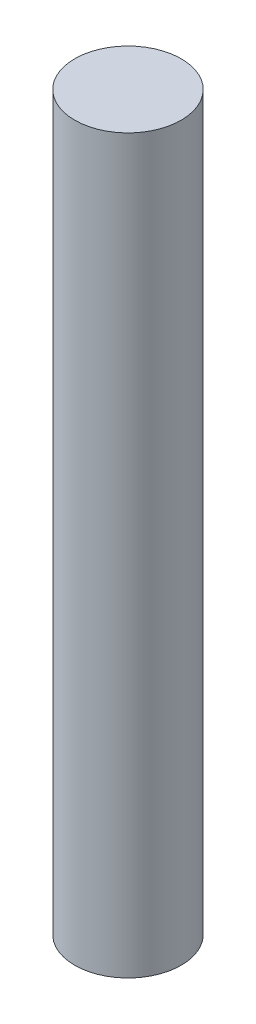
ISO-10303-21;
HEADER;
FILE_DESCRIPTION(('STEP AP214'),'2;1');
FILE_NAME('part.step','',(''),(''),'','','');
FILE_SCHEMA(('AUTOMOTIVE_DESIGN { 1 0 10303 214 1 1 1 1 }'));
ENDSEC;
DATA;
#1=APPLICATION_CONTEXT('core data for automotive mechanical design processes');
#2=APPLICATION_PROTOCOL_DEFINITION('international standard','automotive_design',2000,#1);
#3=PRODUCT_CONTEXT('',#1,'mechanical');
#4=PRODUCT('Part','Part','',(#3));
#5=PRODUCT_RELATED_PRODUCT_CATEGORY('part','',(#4));
#6=PRODUCT_DEFINITION_FORMATION('','',#4);
#7=PRODUCT_DEFINITION_CONTEXT('part definition',#1,'design');
#8=PRODUCT_DEFINITION('design','',#6,#7);
#9=PRODUCT_DEFINITION_SHAPE('','',#8);
#10=(LENGTH_UNIT() NAMED_UNIT(*) SI_UNIT(.MILLI.,.METRE.));
#11=(NAMED_UNIT(*) PLANE_ANGLE_UNIT() SI_UNIT($,.RADIAN.));
#12=(NAMED_UNIT(*) SI_UNIT($,.STERADIAN.) SOLID_ANGLE_UNIT());
#13=UNCERTAINTY_MEASURE_WITH_UNIT(LENGTH_MEASURE(1.E-05),#10,'distance_accuracy_value','');
#14=(GEOMETRIC_REPRESENTATION_CONTEXT(3) GLOBAL_UNCERTAINTY_ASSIGNED_CONTEXT((#13)) GLOBAL_UNIT_ASSIGNED_CONTEXT((#10,
#11,#12)) REPRESENTATION_CONTEXT('',''));
#15=CARTESIAN_POINT('',(0.,0.,0.));
#16=DIRECTION('',(0.,0.,1.));
#17=DIRECTION('',(1.,0.,0.));
#18=AXIS2_PLACEMENT_3D('',#15,#16,#17);
#19=CARTESIAN_POINT('',(0.,55.,0.));
#20=DIRECTION('',(0.,-1.,0.));
#21=DIRECTION('',(0.,0.,-1.));
#22=AXIS2_PLACEMENT_3D('',#19,#20,#21);
#23=CYLINDRICAL_SURFACE('',#22,4.);
#24=CARTESIAN_POINT('',(0.,55.,0.));
#25=DIRECTION('',(0.,1.,0.));
#26=DIRECTION('',(0.,0.,1.));
#27=AXIS2_PLACEMENT_3D('',#24,#25,#26);
#28=CIRCLE('',#27,4.);
#29=CARTESIAN_POINT('',(0.,55.,4.));
#30=VERTEX_POINT('',#29);
#31=EDGE_CURVE('E10',#30,#30,#28,.T.);
#32=ORIENTED_EDGE('',*,*,#31,.F.);
#33=EDGE_LOOP('',(#32));
#34=FACE_BOUND('',#33,.T.);
#35=CARTESIAN_POINT('',(0.,0.,0.));
#36=DIRECTION('',(0.,1.,0.));
#37=DIRECTION('',(0.,0.,1.));
#38=AXIS2_PLACEMENT_3D('',#35,#36,#37);
#39=CIRCLE('',#38,4.);
#40=CARTESIAN_POINT('',(0.,0.,4.));
#41=VERTEX_POINT('',#40);
#42=EDGE_CURVE('E52',#41,#41,#39,.T.);
#43=ORIENTED_EDGE('',*,*,#42,.T.);
#44=EDGE_LOOP('',(#43));
#45=FACE_BOUND('',#44,.T.);
#46=ADVANCED_FACE('F49',(#34,#45),#23,.T.);
#47=CARTESIAN_POINT('',(0.,55.,0.));
#48=DIRECTION('',(0.,1.,0.));
#49=DIRECTION('',(0.,0.,1.));
#50=AXIS2_PLACEMENT_3D('',#47,#48,#49);
#51=PLANE('',#50);
#52=ORIENTED_EDGE('',*,*,#31,.T.);
#53=EDGE_LOOP('',(#52));
#54=FACE_BOUND('',#53,.T.);
#55=ADVANCED_FACE('F66',(#54),#51,.T.);
#56=CARTESIAN_POINT('',(0.,0.,0.));
#57=DIRECTION('',(0.,1.,0.));
#58=DIRECTION('',(0.,0.,1.));
#59=AXIS2_PLACEMENT_3D('',#56,#57,#58);
#60=PLANE('',#59);
#61=ORIENTED_EDGE('',*,*,#42,.F.);
#62=EDGE_LOOP('',(#61));
#63=FACE_BOUND('',#62,.T.);
#64=ADVANCED_FACE('F64',(#63),#60,.F.);
#65=CLOSED_SHELL('',(#46,#55,#64));
#66=MANIFOLD_SOLID_BREP('B2',#65);
#67=ADVANCED_BREP_SHAPE_REPRESENTATION('',(#18,#66),#14);
#68=SHAPE_DEFINITION_REPRESENTATION(#9,#67);
ENDSEC;
END-ISO-10303-21;
